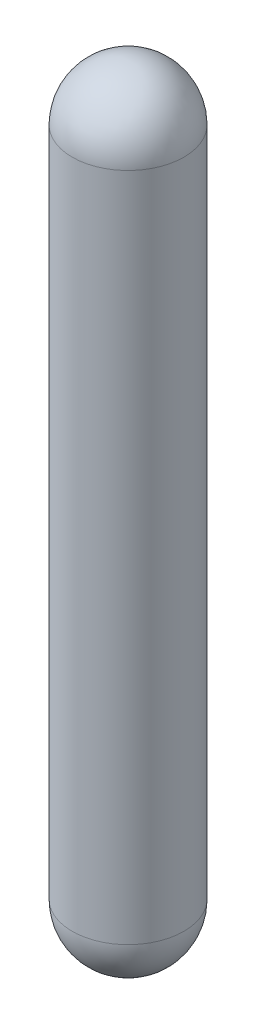
ISO-10303-21;
HEADER;
FILE_DESCRIPTION(('STEP AP214'),'2;1');
FILE_NAME('part.step','',(''),(''),'','','');
FILE_SCHEMA(('AUTOMOTIVE_DESIGN { 1 0 10303 214 1 1 1 1 }'));
ENDSEC;
DATA;
#1=APPLICATION_CONTEXT('core data for automotive mechanical design processes');
#2=APPLICATION_PROTOCOL_DEFINITION('international standard','automotive_design',2000,#1);
#3=PRODUCT_CONTEXT('',#1,'mechanical');
#4=PRODUCT('Part','Part','',(#3));
#5=PRODUCT_RELATED_PRODUCT_CATEGORY('part','',(#4));
#6=PRODUCT_DEFINITION_FORMATION('','',#4);
#7=PRODUCT_DEFINITION_CONTEXT('part definition',#1,'design');
#8=PRODUCT_DEFINITION('design','',#6,#7);
#9=PRODUCT_DEFINITION_SHAPE('','',#8);
#10=(LENGTH_UNIT() NAMED_UNIT(*) SI_UNIT(.MILLI.,.METRE.));
#11=(NAMED_UNIT(*) PLANE_ANGLE_UNIT() SI_UNIT($,.RADIAN.));
#12=(NAMED_UNIT(*) SI_UNIT($,.STERADIAN.) SOLID_ANGLE_UNIT());
#13=UNCERTAINTY_MEASURE_WITH_UNIT(LENGTH_MEASURE(1.E-05),#10,'distance_accuracy_value','');
#14=(GEOMETRIC_REPRESENTATION_CONTEXT(3) GLOBAL_UNCERTAINTY_ASSIGNED_CONTEXT((#13)) GLOBAL_UNIT_ASSIGNED_CONTEXT((#10,
#11,#12)) REPRESENTATION_CONTEXT('',''));
#15=CARTESIAN_POINT('',(0.,0.,0.));
#16=DIRECTION('',(0.,0.,1.));
#17=DIRECTION('',(1.,0.,0.));
#18=AXIS2_PLACEMENT_3D('',#15,#16,#17);
#19=CARTESIAN_POINT('',(0.,609.6,0.));
#20=DIRECTION('',(0.,-1.,0.));
#21=DIRECTION('',(0.,0.,-1.));
#22=AXIS2_PLACEMENT_3D('',#19,#20,#21);
#23=CYLINDRICAL_SURFACE('',#22,101.6);
#24=CARTESIAN_POINT('',(0.,609.6,0.));
#25=DIRECTION('',(0.,1.,0.));
#26=DIRECTION('',(0.,0.,1.));
#27=AXIS2_PLACEMENT_3D('',#24,#25,#26);
#28=CIRCLE('',#27,101.6);
#29=CARTESIAN_POINT('',(0.,609.6,-101.6));
#30=VERTEX_POINT('',#29);
#31=EDGE_CURVE('E45',#30,#30,#28,.T.);
#32=CARTESIAN_POINT('',(0.,-609.6,-1.11022302462516E-13));
#33=DIRECTION('',(0.,-1.,0.));
#34=DIRECTION('',(1.,0.,0.));
#35=AXIS2_PLACEMENT_3D('',#32,#33,#34);
#36=CIRCLE('',#35,101.6);
#37=CARTESIAN_POINT('',(0.,-609.6,-101.6));
#38=VERTEX_POINT('',#37);
#39=EDGE_CURVE('E58',#38,#38,#36,.T.);
#40=CARTESIAN_POINT('',(0.,609.6,-101.6));
#41=CARTESIAN_POINT('',(0.,596.9,-101.6));
#42=CARTESIAN_POINT('',(0.,584.2,-101.6));
#43=CARTESIAN_POINT('',(0.,558.8,-101.6));
#44=CARTESIAN_POINT('',(0.,546.1,-101.6));
#45=CARTESIAN_POINT('',(0.,520.7,-101.6));
#46=CARTESIAN_POINT('',(0.,508.,-101.6));
#47=CARTESIAN_POINT('',(0.,482.6,-101.6));
#48=CARTESIAN_POINT('',(0.,469.9,-101.6));
#49=CARTESIAN_POINT('',(0.,444.5,-101.6));
#50=CARTESIAN_POINT('',(0.,431.8,-101.6));
#51=CARTESIAN_POINT('',(0.,406.4,-101.6));
#52=CARTESIAN_POINT('',(0.,393.7,-101.6));
#53=CARTESIAN_POINT('',(0.,368.3,-101.6));
#54=CARTESIAN_POINT('',(0.,355.6,-101.6));
#55=CARTESIAN_POINT('',(0.,330.2,-101.6));
#56=CARTESIAN_POINT('',(0.,317.5,-101.6));
#57=CARTESIAN_POINT('',(0.,292.1,-101.6));
#58=CARTESIAN_POINT('',(0.,279.4,-101.6));
#59=CARTESIAN_POINT('',(0.,254.,-101.6));
#60=CARTESIAN_POINT('',(0.,241.3,-101.6));
#61=CARTESIAN_POINT('',(0.,215.9,-101.6));
#62=CARTESIAN_POINT('',(0.,203.2,-101.6));
#63=CARTESIAN_POINT('',(0.,177.8,-101.6));
#64=CARTESIAN_POINT('',(0.,165.1,-101.6));
#65=CARTESIAN_POINT('',(0.,139.7,-101.6));
#66=CARTESIAN_POINT('',(0.,127.,-101.6));
#67=CARTESIAN_POINT('',(0.,101.6,-101.6));
#68=CARTESIAN_POINT('',(0.,88.8999999999998,-101.6));
#69=CARTESIAN_POINT('',(0.,63.4999999999998,-101.6));
#70=CARTESIAN_POINT('',(0.,50.7999999999998,-101.6));
#71=CARTESIAN_POINT('',(0.,25.3999999999998,-101.6));
#72=CARTESIAN_POINT('',(0.,12.6999999999998,-101.6));
#73=CARTESIAN_POINT('',(0.,-12.7000000000002,-101.6));
#74=CARTESIAN_POINT('',(0.,-25.4000000000002,-101.6));
#75=CARTESIAN_POINT('',(0.,-50.8000000000003,-101.6));
#76=CARTESIAN_POINT('',(0.,-63.5000000000003,-101.6));
#77=CARTESIAN_POINT('',(0.,-88.9000000000003,-101.6));
#78=CARTESIAN_POINT('',(0.,-101.6,-101.6));
#79=CARTESIAN_POINT('',(0.,-127.,-101.6));
#80=CARTESIAN_POINT('',(0.,-139.7,-101.6));
#81=CARTESIAN_POINT('',(0.,-165.1,-101.6));
#82=CARTESIAN_POINT('',(0.,-177.8,-101.6));
#83=CARTESIAN_POINT('',(0.,-203.2,-101.6));
#84=CARTESIAN_POINT('',(0.,-215.9,-101.6));
#85=CARTESIAN_POINT('',(0.,-241.3,-101.6));
#86=CARTESIAN_POINT('',(0.,-254.,-101.6));
#87=CARTESIAN_POINT('',(0.,-279.4,-101.6));
#88=CARTESIAN_POINT('',(0.,-292.1,-101.6));
#89=CARTESIAN_POINT('',(0.,-317.5,-101.6));
#90=CARTESIAN_POINT('',(0.,-330.2,-101.6));
#91=CARTESIAN_POINT('',(0.,-355.6,-101.6));
#92=CARTESIAN_POINT('',(0.,-368.3,-101.6));
#93=CARTESIAN_POINT('',(0.,-393.7,-101.6));
#94=CARTESIAN_POINT('',(0.,-406.4,-101.6));
#95=CARTESIAN_POINT('',(0.,-431.8,-101.6));
#96=CARTESIAN_POINT('',(0.,-444.5,-101.6));
#97=CARTESIAN_POINT('',(0.,-469.9,-101.6));
#98=CARTESIAN_POINT('',(0.,-482.6,-101.6));
#99=CARTESIAN_POINT('',(0.,-508.,-101.6));
#100=CARTESIAN_POINT('',(0.,-520.7,-101.6));
#101=CARTESIAN_POINT('',(0.,-546.1,-101.6));
#102=CARTESIAN_POINT('',(0.,-558.8,-101.6));
#103=CARTESIAN_POINT('',(0.,-584.200000000001,-101.6));
#104=CARTESIAN_POINT('',(0.,-596.9,-101.6));
#105=CARTESIAN_POINT('',(0.,-609.6,-101.6));
#106=B_SPLINE_CURVE_WITH_KNOTS('',3,(#40,#41,#42,#43,#44,#45,#46,#47,#48,#49,#50,#51,#52,#53,
#54,#55,#56,#57,#58,#59,#60,#61,#62,#63,#64,#65,#66,#67,#68,#69,#70,#71,#72,#73,#74,#75,#76,#77,
#78,#79,#80,#81,#82,#83,#84,#85,#86,#87,#88,#89,#90,#91,#92,#93,#94,#95,#96,#97,#98,#99,#100,
#101,#102,#103,#104,#105),.UNSPECIFIED.,.F.,.F.,(4,2,2,2,2,2,2,2,2,2,2,2,2,2,2,2,2,2,2,2,2,2,2,
2,2,2,2,2,2,2,2,2,4),(0.,38.1,76.2,114.3,152.4,190.5,228.6,266.7,304.8,342.9,381.,419.1,457.2,
495.3,533.4,571.5,609.6,647.7,685.8,723.9,762.,800.1,838.2,876.3,914.4,952.5,990.6,1028.7,
1066.8,1104.9,1143.,1181.1,1219.2),.UNSPECIFIED.);
#107=EDGE_CURVE('BSEAM37',#30,#38,#106,.T.);
#108=ORIENTED_EDGE('',*,*,#31,.F.);
#109=ORIENTED_EDGE('',*,*,#39,.F.);
#110=ORIENTED_EDGE('',*,*,#107,.T.);
#111=ORIENTED_EDGE('',*,*,#107,.F.);
#112=EDGE_LOOP('',(#108,#110,#109,#111));
#113=FACE_BOUND('',#112,.T.);
#114=ADVANCED_FACE('F37',(#113),#23,.T.);
#115=CARTESIAN_POINT('',(0.,609.6,-1.11022302462516E-13));
#116=DIRECTION('',(-1.,0.,0.));
#117=DIRECTION('',(0.,0.,1.));
#118=AXIS2_PLACEMENT_3D('',#115,#116,#117);
#119=SPHERICAL_SURFACE('',#118,101.6);
#120=CARTESIAN_POINT('',(0.,609.6,-1.11022302462516E-13));
#121=DIRECTION('',(0.,1.,0.));
#122=DIRECTION('',(0.,0.,1.));
#123=AXIS2_PLACEMENT_3D('',#120,#121,#122);
#124=SPHERICAL_SURFACE('',#123,101.6);
#125=ORIENTED_EDGE('',*,*,#31,.T.);
#126=EDGE_LOOP('',(#125));
#127=FACE_BOUND('',#126,.T.);
#128=ADVANCED_FACE('F65',(#127),#124,.T.);
#129=CARTESIAN_POINT('',(0.,-609.6,-1.11022302462516E-13));
#130=DIRECTION('',(-1.,0.,0.));
#131=DIRECTION('',(0.,0.,1.));
#132=AXIS2_PLACEMENT_3D('',#129,#130,#131);
#133=SPHERICAL_SURFACE('',#132,101.6);
#134=CARTESIAN_POINT('',(0.,-609.6,-1.11022302462516E-13));
#135=DIRECTION('',(0.,-1.,0.));
#136=DIRECTION('',(1.,0.,0.));
#137=AXIS2_PLACEMENT_3D('',#134,#135,#136);
#138=SPHERICAL_SURFACE('',#137,101.6);
#139=ORIENTED_EDGE('',*,*,#39,.T.);
#140=EDGE_LOOP('',(#139));
#141=FACE_BOUND('',#140,.T.);
#142=ADVANCED_FACE('F62',(#141),#138,.T.);
#143=CLOSED_SHELL('',(#114,#128,#142));
#144=CARTESIAN_POINT('',(0.,-609.6,-1.11022302462516E-13));
#145=DIRECTION('',(0.,1.,0.));
#146=DIRECTION('',(1.,0.,0.));
#147=AXIS2_PLACEMENT_3D('',#144,#145,#146);
#148=PLANE('',#147);
#149=CARTESIAN_POINT('',(0.,-609.6,0.));
#150=DIRECTION('',(0.,1.,0.));
#151=DIRECTION('',(0.,0.,1.));
#152=AXIS2_PLACEMENT_3D('',#149,#150,#151);
#153=CIRCLE('',#152,95.25);
#154=CARTESIAN_POINT('',(0.,-609.6,-95.25));
#155=VERTEX_POINT('',#154);
#156=EDGE_CURVE('E49',#155,#155,#153,.T.);
#157=ORIENTED_EDGE('',*,*,#156,.T.);
#158=EDGE_LOOP('',(#157));
#159=FACE_BOUND('',#158,.T.);
#160=ADVANCED_FACE('F85',(#159),#148,.T.);
#161=CARTESIAN_POINT('',(0.,609.6,-1.11022302462516E-13));
#162=DIRECTION('',(0.,-1.,0.));
#163=DIRECTION('',(1.,0.,0.));
#164=AXIS2_PLACEMENT_3D('',#161,#162,#163);
#165=PLANE('',#164);
#166=CARTESIAN_POINT('',(0.,609.6,0.));
#167=DIRECTION('',(0.,-1.,0.));
#168=DIRECTION('',(0.,0.,-1.));
#169=AXIS2_PLACEMENT_3D('',#166,#167,#168);
#170=CIRCLE('',#169,95.25);
#171=CARTESIAN_POINT('',(0.,609.6,-95.25));
#172=VERTEX_POINT('',#171);
#173=EDGE_CURVE('E53',#172,#172,#170,.T.);
#174=ORIENTED_EDGE('',*,*,#173,.T.);
#175=EDGE_LOOP('',(#174));
#176=FACE_BOUND('',#175,.T.);
#177=ADVANCED_FACE('F87',(#176),#165,.T.);
#178=CARTESIAN_POINT('',(0.,609.6,0.));
#179=DIRECTION('',(0.,-1.,0.));
#180=DIRECTION('',(0.,0.,-1.));
#181=AXIS2_PLACEMENT_3D('',#178,#179,#180);
#182=CYLINDRICAL_SURFACE('',#181,95.25);
#183=CARTESIAN_POINT('',(0.,609.6,-95.25));
#184=CARTESIAN_POINT('',(0.,596.9,-95.25));
#185=CARTESIAN_POINT('',(0.,584.2,-95.25));
#186=CARTESIAN_POINT('',(0.,558.8,-95.25));
#187=CARTESIAN_POINT('',(0.,546.1,-95.25));
#188=CARTESIAN_POINT('',(0.,520.7,-95.25));
#189=CARTESIAN_POINT('',(0.,508.,-95.25));
#190=CARTESIAN_POINT('',(0.,482.6,-95.25));
#191=CARTESIAN_POINT('',(0.,469.9,-95.25));
#192=CARTESIAN_POINT('',(0.,444.5,-95.25));
#193=CARTESIAN_POINT('',(0.,431.8,-95.25));
#194=CARTESIAN_POINT('',(0.,406.4,-95.25));
#195=CARTESIAN_POINT('',(0.,393.7,-95.25));
#196=CARTESIAN_POINT('',(0.,368.3,-95.25));
#197=CARTESIAN_POINT('',(0.,355.6,-95.25));
#198=CARTESIAN_POINT('',(0.,330.2,-95.25));
#199=CARTESIAN_POINT('',(0.,317.5,-95.25));
#200=CARTESIAN_POINT('',(0.,292.1,-95.25));
#201=CARTESIAN_POINT('',(0.,279.4,-95.25));
#202=CARTESIAN_POINT('',(0.,254.,-95.25));
#203=CARTESIAN_POINT('',(0.,241.3,-95.25));
#204=CARTESIAN_POINT('',(0.,215.9,-95.25));
#205=CARTESIAN_POINT('',(0.,203.2,-95.25));
#206=CARTESIAN_POINT('',(0.,177.8,-95.25));
#207=CARTESIAN_POINT('',(0.,165.1,-95.25));
#208=CARTESIAN_POINT('',(0.,139.7,-95.25));
#209=CARTESIAN_POINT('',(0.,127.,-95.25));
#210=CARTESIAN_POINT('',(0.,101.6,-95.25));
#211=CARTESIAN_POINT('',(0.,88.9000000000002,-95.25));
#212=CARTESIAN_POINT('',(0.,63.5000000000002,-95.25));
#213=CARTESIAN_POINT('',(0.,50.8000000000001,-95.25));
#214=CARTESIAN_POINT('',(0.,25.4000000000001,-95.25));
#215=CARTESIAN_POINT('',(0.,12.7000000000001,-95.25));
#216=CARTESIAN_POINT('',(0.,-12.6999999999999,-95.25));
#217=CARTESIAN_POINT('',(0.,-25.3999999999999,-95.25));
#218=CARTESIAN_POINT('',(0.,-50.7999999999999,-95.25));
#219=CARTESIAN_POINT('',(0.,-63.4999999999999,-95.25));
#220=CARTESIAN_POINT('',(0.,-88.8999999999999,-95.25));
#221=CARTESIAN_POINT('',(0.,-101.6,-95.25));
#222=CARTESIAN_POINT('',(0.,-127.,-95.25));
#223=CARTESIAN_POINT('',(0.,-139.7,-95.25));
#224=CARTESIAN_POINT('',(0.,-165.1,-95.25));
#225=CARTESIAN_POINT('',(0.,-177.8,-95.25));
#226=CARTESIAN_POINT('',(0.,-203.2,-95.25));
#227=CARTESIAN_POINT('',(0.,-215.9,-95.25));
#228=CARTESIAN_POINT('',(0.,-241.3,-95.25));
#229=CARTESIAN_POINT('',(0.,-254.,-95.25));
#230=CARTESIAN_POINT('',(0.,-279.4,-95.25));
#231=CARTESIAN_POINT('',(0.,-292.1,-95.25));
#232=CARTESIAN_POINT('',(0.,-317.5,-95.25));
#233=CARTESIAN_POINT('',(0.,-330.2,-95.25));
#234=CARTESIAN_POINT('',(0.,-355.6,-95.25));
#235=CARTESIAN_POINT('',(0.,-368.3,-95.25));
#236=CARTESIAN_POINT('',(0.,-393.7,-95.25));
#237=CARTESIAN_POINT('',(0.,-406.4,-95.25));
#238=CARTESIAN_POINT('',(0.,-431.8,-95.25));
#239=CARTESIAN_POINT('',(0.,-444.5,-95.25));
#240=CARTESIAN_POINT('',(0.,-469.9,-95.25));
#241=CARTESIAN_POINT('',(0.,-482.6,-95.25));
#242=CARTESIAN_POINT('',(0.,-508.,-95.25));
#243=CARTESIAN_POINT('',(0.,-520.7,-95.25));
#244=CARTESIAN_POINT('',(0.,-546.1,-95.25));
#245=CARTESIAN_POINT('',(0.,-558.8,-95.25));
#246=CARTESIAN_POINT('',(0.,-584.2,-95.25));
#247=CARTESIAN_POINT('',(0.,-596.9,-95.25));
#248=CARTESIAN_POINT('',(0.,-609.6,-95.25));
#249=B_SPLINE_CURVE_WITH_KNOTS('',3,(#183,#184,#185,#186,#187,#188,#189,#190,#191,#192,#193,
#194,#195,#196,#197,#198,#199,#200,#201,#202,#203,#204,#205,#206,#207,#208,#209,#210,#211,#212,
#213,#214,#215,#216,#217,#218,#219,#220,#221,#222,#223,#224,#225,#226,#227,#228,#229,#230,#231,
#232,#233,#234,#235,#236,#237,#238,#239,#240,#241,#242,#243,#244,#245,#246,#247,#248),
.UNSPECIFIED.,.F.,.F.,(4,2,2,2,2,2,2,2,2,2,2,2,2,2,2,2,2,2,2,2,2,2,2,2,2,2,2,2,2,2,2,2,4),(0.,
38.0999999999999,76.1999999999999,114.3,152.4,190.5,228.6,266.7,304.8,342.9,381.,419.1,457.2,
495.3,533.4,571.5,609.6,647.7,685.8,723.9,762.,800.1,838.2,876.3,914.4,952.5,990.6,1028.7,
1066.8,1104.9,1143.,1181.1,1219.2),.UNSPECIFIED.);
#250=EDGE_CURVE('BSEAM73',#172,#155,#249,.T.);
#251=ORIENTED_EDGE('',*,*,#173,.F.);
#252=ORIENTED_EDGE('',*,*,#156,.F.);
#253=ORIENTED_EDGE('',*,*,#250,.T.);
#254=ORIENTED_EDGE('',*,*,#250,.F.);
#255=EDGE_LOOP('',(#251,#253,#252,#254));
#256=FACE_BOUND('',#255,.T.);
#257=ADVANCED_FACE('F73',(#256),#182,.F.);
#258=CLOSED_SHELL('',(#160,#177,#257));
#259=CARTESIAN_POINT('',(0.,609.6,-1.11022302462516E-13));
#260=DIRECTION('',(-1.,0.,0.));
#261=DIRECTION('',(0.,0.,1.));
#262=AXIS2_PLACEMENT_3D('',#259,#260,#261);
#263=SPHERICAL_SURFACE('',#262,95.25);
#264=CARTESIAN_POINT('',(0.,609.6,-1.11022302462516E-13));
#265=DIRECTION('',(0.,-1.,0.));
#266=DIRECTION('',(0.,0.,-1.));
#267=AXIS2_PLACEMENT_3D('',#264,#265,#266);
#268=SPHERICAL_SURFACE('',#267,95.25);
#269=CARTESIAN_POINT('',(0.,615.95,0.));
#270=DIRECTION('',(0.,-1.,0.));
#271=DIRECTION('',(0.,0.,-1.));
#272=AXIS2_PLACEMENT_3D('',#269,#270,#271);
#273=CIRCLE('',#272,95.0380976240581);
#274=CARTESIAN_POINT('',(0.,615.95,-95.0380976240582));
#275=VERTEX_POINT('',#274);
#276=EDGE_CURVE('E10',#275,#275,#273,.F.);
#277=ORIENTED_EDGE('',*,*,#276,.F.);
#278=EDGE_LOOP('',(#277));
#279=FACE_BOUND('',#278,.T.);
#280=ADVANCED_FACE('F74',(#279),#268,.F.);
#281=CARTESIAN_POINT('',(0.,615.95,0.));
#282=DIRECTION('',(0.,-1.,0.));
#283=DIRECTION('',(1.,0.,0.));
#284=AXIS2_PLACEMENT_3D('',#281,#282,#283);
#285=PLANE('',#284);
#286=ORIENTED_EDGE('',*,*,#276,.T.);
#287=EDGE_LOOP('',(#286));
#288=FACE_BOUND('',#287,.T.);
#289=ADVANCED_FACE('F39',(#288),#285,.F.);
#290=CLOSED_SHELL('',(#280,#289));
#291=ORIENTED_CLOSED_SHELL('',*,#258,.T.);
#292=ORIENTED_CLOSED_SHELL('',*,#290,.T.);
#293=BREP_WITH_VOIDS('B2',#143,(#291,#292));
#294=ADVANCED_BREP_SHAPE_REPRESENTATION('',(#18,#293),#14);
#295=SHAPE_DEFINITION_REPRESENTATION(#9,#294);
ENDSEC;
END-ISO-10303-21;
